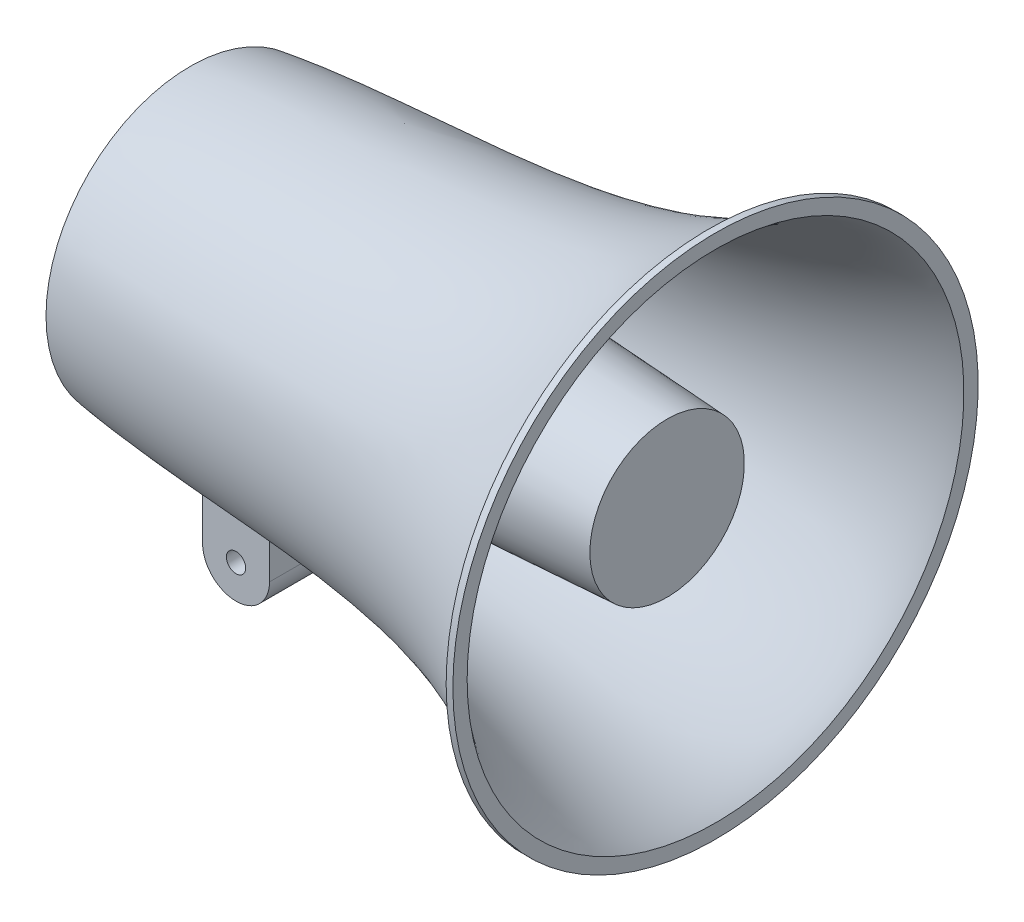
ISO-10303-21;
HEADER;
FILE_DESCRIPTION(('STEP AP214'),'2;1');
FILE_NAME('part.step','',(''),(''),'','','');
FILE_SCHEMA(('AUTOMOTIVE_DESIGN { 1 0 10303 214 1 1 1 1 }'));
ENDSEC;
DATA;
#1=APPLICATION_CONTEXT('core data for automotive mechanical design processes');
#2=APPLICATION_PROTOCOL_DEFINITION('international standard','automotive_design',2000,#1);
#3=PRODUCT_CONTEXT('',#1,'mechanical');
#4=PRODUCT('Part','Part','',(#3));
#5=PRODUCT_RELATED_PRODUCT_CATEGORY('part','',(#4));
#6=PRODUCT_DEFINITION_FORMATION('','',#4);
#7=PRODUCT_DEFINITION_CONTEXT('part definition',#1,'design');
#8=PRODUCT_DEFINITION('design','',#6,#7);
#9=PRODUCT_DEFINITION_SHAPE('','',#8);
#10=(LENGTH_UNIT() NAMED_UNIT(*) SI_UNIT(.MILLI.,.METRE.));
#11=(NAMED_UNIT(*) PLANE_ANGLE_UNIT() SI_UNIT($,.RADIAN.));
#12=(NAMED_UNIT(*) SI_UNIT($,.STERADIAN.) SOLID_ANGLE_UNIT());
#13=UNCERTAINTY_MEASURE_WITH_UNIT(LENGTH_MEASURE(1.E-05),#10,'distance_accuracy_value','');
#14=(GEOMETRIC_REPRESENTATION_CONTEXT(3) GLOBAL_UNCERTAINTY_ASSIGNED_CONTEXT((#13)) GLOBAL_UNIT_ASSIGNED_CONTEXT((#10,
#11,#12)) REPRESENTATION_CONTEXT('',''));
#15=CARTESIAN_POINT('',(0.,0.,0.));
#16=DIRECTION('',(0.,0.,1.));
#17=DIRECTION('',(1.,0.,0.));
#18=AXIS2_PLACEMENT_3D('',#15,#16,#17);
#19=CARTESIAN_POINT('',(127.882024274006,61.8874618757175,0.));
#20=CARTESIAN_POINT('',(90.8044132288741,35.8427549110067,0.));
#21=CARTESIAN_POINT('',(42.3015007337847,41.7217586179619,0.));
#22=CARTESIAN_POINT('',(0.,35.56,0.));
#23=B_SPLINE_CURVE_WITH_KNOTS('',3,(#19,#20,#21,#22),.UNSPECIFIED.,.F.,.F.,(4,4),(0.,1.),.UNSPECIFIED.);
#24=CARTESIAN_POINT('',(0.,0.,0.));
#25=DIRECTION('',(-1.,0.,0.));
#26=AXIS1_PLACEMENT('',#24,#25);
#27=SURFACE_OF_REVOLUTION('',#23,#26);
#28=CARTESIAN_POINT('',(127.882024274006,0.,0.));
#29=DIRECTION('',(-1.,0.,0.));
#30=DIRECTION('',(0.,0.,1.));
#31=AXIS2_PLACEMENT_3D('',#28,#29,#30);
#32=CIRCLE('',#31,61.8874618757175);
#33=CARTESIAN_POINT('',(127.882024274006,0.,61.8874618757175));
#34=VERTEX_POINT('',#33);
#35=EDGE_CURVE('E94',#34,#34,#32,.T.);
#36=ORIENTED_EDGE('',*,*,#35,.T.);
#37=EDGE_LOOP('',(#36));
#38=FACE_BOUND('',#37,.T.);
#39=CARTESIAN_POINT('',(0.,0.,0.));
#40=DIRECTION('',(-1.,0.,0.));
#41=DIRECTION('',(0.,0.,1.));
#42=AXIS2_PLACEMENT_3D('',#39,#40,#41);
#43=CIRCLE('',#42,35.56);
#44=CARTESIAN_POINT('',(0.,0.,35.56));
#45=VERTEX_POINT('',#44);
#46=EDGE_CURVE('E90',#45,#45,#43,.T.);
#47=ORIENTED_EDGE('',*,*,#46,.F.);
#48=EDGE_LOOP('',(#47));
#49=FACE_BOUND('',#48,.T.);
#50=CARTESIAN_POINT('',(27.178,0.,0.));
#51=DIRECTION('',(-1.,0.,0.));
#52=DIRECTION('',(0.,0.,1.));
#53=AXIS2_PLACEMENT_3D('',#50,#51,#52);
#54=CIRCLE('',#53,38.2471542027441);
#55=CARTESIAN_POINT('',(27.178,-37.4804002727891,-7.62));
#56=VERTEX_POINT('',#55);
#57=CARTESIAN_POINT('',(27.178,-37.4804002727891,7.62));
#58=VERTEX_POINT('',#57);
#59=EDGE_CURVE('E11',#56,#58,#54,.T.);
#60=ORIENTED_EDGE('',*,*,#59,.F.);
#61=CARTESIAN_POINT('',(10.668,-36.0763472887783,-7.62));
#62=CARTESIAN_POINT('',(11.3546755637936,-36.1488445242103,-7.62));
#63=CARTESIAN_POINT('',(12.0415882481351,-36.2190699128754,-7.62));
#64=CARTESIAN_POINT('',(13.4157766772698,-36.355371462205,-7.62));
#65=CARTESIAN_POINT('',(14.1030523930679,-36.4214479149092,-7.62));
#66=CARTESIAN_POINT('',(15.4779277412028,-36.5498538504772,-7.62));
#67=CARTESIAN_POINT('',(16.1655273609823,-36.612183468202,-7.62));
#68=CARTESIAN_POINT('',(17.5410143941941,-36.7334869230939,-7.62));
#69=CARTESIAN_POINT('',(18.2289018043845,-36.7924607970877,-7.62));
#70=CARTESIAN_POINT('',(19.6049120074151,-36.9074351380669,-7.62));
#71=CARTESIAN_POINT('',(20.293034795792,-36.9634356585934,-7.62));
#72=CARTESIAN_POINT('',(21.6695037798695,-37.072841532166,-7.62));
#73=CARTESIAN_POINT('',(22.3578499807939,-37.1262468193515,-7.62));
#74=CARTESIAN_POINT('',(23.7347374571186,-37.2308327076714,-7.62));
#75=CARTESIAN_POINT('',(24.4232787390018,-37.2820132231885,-7.62));
#76=CARTESIAN_POINT('',(25.8005293884462,-37.3825127833583,-7.62));
#77=CARTESIAN_POINT('',(26.489238762319,-37.4318317416216,-7.62));
#78=CARTESIAN_POINT('',(27.178,-37.4804002727891,-7.61999999999999));
#79=B_SPLINE_CURVE_WITH_KNOTS('',3,(#61,#62,#63,#64,#65,#66,#67,#68,#69,#70,#71,#72,#73,#74,#75,
#76,#77,#78),.UNSPECIFIED.,.F.,.F.,(4,2,2,2,2,2,2,2,4),(0.,2.07146822178206,4.14279047110517,
6.21403812202543,8.28526303827297,10.3564506453109,12.4276907865564,14.49901056632,
16.5704263521352),.UNSPECIFIED.);
#80=CARTESIAN_POINT('',(10.668,-36.0763472887783,-7.62));
#81=VERTEX_POINT('',#80);
#82=EDGE_CURVE('E144',#81,#56,#79,.T.);
#83=ORIENTED_EDGE('',*,*,#82,.F.);
#84=CARTESIAN_POINT('',(10.668,0.,0.));
#85=DIRECTION('',(-1.,0.,0.));
#86=DIRECTION('',(0.,0.,1.));
#87=AXIS2_PLACEMENT_3D('',#84,#85,#86);
#88=CIRCLE('',#87,36.8723098503544);
#89=CARTESIAN_POINT('',(10.668,-36.0763472887783,7.62));
#90=VERTEX_POINT('',#89);
#91=EDGE_CURVE('E191',#90,#81,#88,.F.);
#92=ORIENTED_EDGE('',*,*,#91,.F.);
#93=CARTESIAN_POINT('',(10.668,-36.0763472887783,7.62));
#94=CARTESIAN_POINT('',(11.3546755637936,-36.1488445242103,7.62));
#95=CARTESIAN_POINT('',(12.0415882481351,-36.2190699128754,7.62));
#96=CARTESIAN_POINT('',(13.4157766772698,-36.355371462205,7.62));
#97=CARTESIAN_POINT('',(14.1030523930679,-36.4214479149092,7.62));
#98=CARTESIAN_POINT('',(15.4779277412028,-36.5498538504772,7.62));
#99=CARTESIAN_POINT('',(16.1655273609823,-36.612183468202,7.62));
#100=CARTESIAN_POINT('',(17.5410143941941,-36.7334869230939,7.62));
#101=CARTESIAN_POINT('',(18.2289018043845,-36.7924607970877,7.62));
#102=CARTESIAN_POINT('',(19.6049120074151,-36.9074351380669,7.62));
#103=CARTESIAN_POINT('',(20.293034795792,-36.9634356585934,7.62));
#104=CARTESIAN_POINT('',(21.6695037798695,-37.072841532166,7.62));
#105=CARTESIAN_POINT('',(22.3578499807939,-37.1262468193515,7.62));
#106=CARTESIAN_POINT('',(23.7347374571186,-37.2308327076714,7.62));
#107=CARTESIAN_POINT('',(24.4232787390018,-37.2820132231885,7.62));
#108=CARTESIAN_POINT('',(25.8005293884462,-37.3825127833583,7.62));
#109=CARTESIAN_POINT('',(26.489238762319,-37.4318317416216,7.62));
#110=CARTESIAN_POINT('',(27.178,-37.4804002727891,7.62));
#111=B_SPLINE_CURVE_WITH_KNOTS('',3,(#93,#94,#95,#96,#97,#98,#99,#100,#101,#102,#103,#104,#105,
#106,#107,#108,#109,#110),.UNSPECIFIED.,.F.,.F.,(4,2,2,2,2,2,2,2,4),(0.,2.07146822178206,
4.14279047110517,6.21403812202543,8.28526303827297,10.3564506453109,12.4276907865564,
14.49901056632,16.5704263521352),.UNSPECIFIED.);
#112=EDGE_CURVE('E40',#90,#58,#111,.T.);
#113=ORIENTED_EDGE('',*,*,#112,.T.);
#114=EDGE_LOOP('',(#60,#83,#92,#113));
#115=FACE_BOUND('',#114,.T.);
#116=ADVANCED_FACE('F32',(#38,#49,#115),#27,.T.);
#117=CARTESIAN_POINT('',(117.602,19.05,0.));
#118=DIRECTION('',(-1.,0.,0.));
#119=DIRECTION('',(0.,0.,1.));
#120=AXIS2_PLACEMENT_3D('',#117,#118,#119);
#121=PLANE('',#120);
#122=CARTESIAN_POINT('',(117.602,0.,0.));
#123=DIRECTION('',(-1.,0.,0.));
#124=DIRECTION('',(0.,0.,1.));
#125=AXIS2_PLACEMENT_3D('',#122,#123,#124);
#126=CIRCLE('',#125,19.05);
#127=CARTESIAN_POINT('',(117.602,0.,19.05));
#128=VERTEX_POINT('',#127);
#129=EDGE_CURVE('E193',#128,#128,#126,.T.);
#130=ORIENTED_EDGE('',*,*,#129,.F.);
#131=EDGE_LOOP('',(#130));
#132=FACE_BOUND('',#131,.T.);
#133=ADVANCED_FACE('F34',(#132),#121,.F.);
#134=CARTESIAN_POINT('',(117.602,0.,0.));
#135=DIRECTION('',(-1.,0.,0.));
#136=DIRECTION('',(0.,0.,1.));
#137=AXIS2_PLACEMENT_3D('',#134,#135,#136);
#138=CONICAL_SURFACE('',#137,19.05,0.0564445228975095);
#139=CARTESIAN_POINT('',(48.26,0.,0.));
#140=DIRECTION('',(-1.,0.,0.));
#141=DIRECTION('',(0.,0.,1.));
#142=AXIS2_PLACEMENT_3D('',#139,#140,#141);
#143=CIRCLE('',#142,22.968138032738);
#144=CARTESIAN_POINT('',(48.26,0.,22.968138032738));
#145=VERTEX_POINT('',#144);
#146=EDGE_CURVE('E195',#145,#145,#143,.T.);
#147=ORIENTED_EDGE('',*,*,#146,.F.);
#148=EDGE_LOOP('',(#147));
#149=FACE_BOUND('',#148,.T.);
#150=ORIENTED_EDGE('',*,*,#129,.T.);
#151=EDGE_LOOP('',(#150));
#152=FACE_BOUND('',#151,.T.);
#153=ADVANCED_FACE('F119',(#149,#152),#138,.T.);
#154=CARTESIAN_POINT('',(48.26,38.6704164179285,0.));
#155=DIRECTION('',(-1.,0.,0.));
#156=DIRECTION('',(0.,0.,1.));
#157=AXIS2_PLACEMENT_3D('',#154,#155,#156);
#158=PLANE('',#157);
#159=CARTESIAN_POINT('',(48.26,0.,0.));
#160=DIRECTION('',(-1.,0.,0.));
#161=DIRECTION('',(0.,0.,1.));
#162=AXIS2_PLACEMENT_3D('',#159,#160,#161);
#163=CIRCLE('',#162,38.6704164179285);
#164=CARTESIAN_POINT('',(48.26,0.,38.6704164179285));
#165=VERTEX_POINT('',#164);
#166=EDGE_CURVE('E200',#165,#165,#163,.T.);
#167=ORIENTED_EDGE('',*,*,#166,.F.);
#168=EDGE_LOOP('',(#167));
#169=FACE_BOUND('',#168,.T.);
#170=ORIENTED_EDGE('',*,*,#146,.T.);
#171=EDGE_LOOP('',(#170));
#172=FACE_BOUND('',#171,.T.);
#173=ADVANCED_FACE('F115',(#169,#172),#158,.F.);
#174=CARTESIAN_POINT('',(48.26,38.6704164179285,0.));
#175=CARTESIAN_POINT('',(60.5791680522577,39.2621312735668,0.));
#176=CARTESIAN_POINT('',(92.7596563229144,42.3505388280006,0.));
#177=CARTESIAN_POINT('',(122.108766376293,55.0340535043362,0.));
#178=CARTESIAN_POINT('',(129.54,61.2519918368869,0.));
#179=B_SPLINE_CURVE_WITH_KNOTS('',3,(#174,#175,#176,#177,#178),.UNSPECIFIED.,.F.,.F.,(4,1,4),
(0.,0.316214134256956,0.787254411821224),.UNSPECIFIED.);
#180=CARTESIAN_POINT('',(0.,0.,0.));
#181=DIRECTION('',(-1.,0.,0.));
#182=AXIS1_PLACEMENT('',#180,#181);
#183=SURFACE_OF_REVOLUTION('',#179,#182);
#184=CARTESIAN_POINT('',(129.54,0.,0.));
#185=DIRECTION('',(-1.,0.,0.));
#186=DIRECTION('',(0.,0.,1.));
#187=AXIS2_PLACEMENT_3D('',#184,#185,#186);
#188=CIRCLE('',#187,61.2519918368869);
#189=CARTESIAN_POINT('',(129.54,0.,61.2519918368869));
#190=VERTEX_POINT('',#189);
#191=EDGE_CURVE('E203',#190,#190,#188,.T.);
#192=ORIENTED_EDGE('',*,*,#191,.F.);
#193=EDGE_LOOP('',(#192));
#194=FACE_BOUND('',#193,.T.);
#195=ORIENTED_EDGE('',*,*,#166,.T.);
#196=EDGE_LOOP('',(#195));
#197=FACE_BOUND('',#196,.T.);
#198=ADVANCED_FACE('F110',(#194,#197),#183,.T.);
#199=CARTESIAN_POINT('',(129.54,64.77,0.));
#200=DIRECTION('',(-1.,0.,0.));
#201=DIRECTION('',(0.,0.,1.));
#202=AXIS2_PLACEMENT_3D('',#199,#200,#201);
#203=PLANE('',#202);
#204=CARTESIAN_POINT('',(129.54,0.,0.));
#205=DIRECTION('',(-1.,0.,0.));
#206=DIRECTION('',(0.,0.,1.));
#207=AXIS2_PLACEMENT_3D('',#204,#205,#206);
#208=CIRCLE('',#207,64.77);
#209=CARTESIAN_POINT('',(129.54,0.,64.77));
#210=VERTEX_POINT('',#209);
#211=EDGE_CURVE('E206',#210,#210,#208,.T.);
#212=ORIENTED_EDGE('',*,*,#211,.F.);
#213=EDGE_LOOP('',(#212));
#214=FACE_BOUND('',#213,.T.);
#215=ORIENTED_EDGE('',*,*,#191,.T.);
#216=EDGE_LOOP('',(#215));
#217=FACE_BOUND('',#216,.T.);
#218=ADVANCED_FACE('F114',(#214,#217),#203,.F.);
#219=CARTESIAN_POINT('',(0.,0.,0.));
#220=DIRECTION('',(-1.,0.,0.));
#221=DIRECTION('',(0.,0.,1.));
#222=AXIS2_PLACEMENT_3D('',#219,#220,#221);
#223=CYLINDRICAL_SURFACE('',#222,64.77);
#224=CARTESIAN_POINT('',(127.882024274006,0.,0.));
#225=DIRECTION('',(-1.,0.,0.));
#226=DIRECTION('',(0.,0.,1.));
#227=AXIS2_PLACEMENT_3D('',#224,#225,#226);
#228=CIRCLE('',#227,64.77);
#229=CARTESIAN_POINT('',(127.882024274006,0.,64.77));
#230=VERTEX_POINT('',#229);
#231=EDGE_CURVE('E209',#230,#230,#228,.T.);
#232=ORIENTED_EDGE('',*,*,#231,.F.);
#233=EDGE_LOOP('',(#232));
#234=FACE_BOUND('',#233,.T.);
#235=ORIENTED_EDGE('',*,*,#211,.T.);
#236=EDGE_LOOP('',(#235));
#237=FACE_BOUND('',#236,.T.);
#238=ADVANCED_FACE('F216',(#234,#237),#223,.T.);
#239=CARTESIAN_POINT('',(127.882024274006,61.8874618757175,0.));
#240=DIRECTION('',(1.,0.,0.));
#241=DIRECTION('',(0.,0.,-1.));
#242=AXIS2_PLACEMENT_3D('',#239,#240,#241);
#243=PLANE('',#242);
#244=ORIENTED_EDGE('',*,*,#35,.F.);
#245=EDGE_LOOP('',(#244));
#246=FACE_BOUND('',#245,.T.);
#247=ORIENTED_EDGE('',*,*,#231,.T.);
#248=EDGE_LOOP('',(#247));
#249=FACE_BOUND('',#248,.T.);
#250=ADVANCED_FACE('F141',(#246,#249),#243,.F.);
#251=CARTESIAN_POINT('',(0.,0.,0.));
#252=DIRECTION('',(1.,0.,0.));
#253=DIRECTION('',(0.,0.,-1.));
#254=AXIS2_PLACEMENT_3D('',#251,#252,#253);
#255=PLANE('',#254);
#256=ORIENTED_EDGE('',*,*,#46,.T.);
#257=EDGE_LOOP('',(#256));
#258=FACE_BOUND('',#257,.T.);
#259=ADVANCED_FACE('F139',(#258),#255,.F.);
#260=CARTESIAN_POINT('',(18.923,-57.15,7.62));
#261=DIRECTION('',(0.,0.,1.));
#262=DIRECTION('',(1.,0.,0.));
#263=AXIS2_PLACEMENT_3D('',#260,#261,#262);
#264=PLANE('',#263);
#265=CARTESIAN_POINT('',(18.923,-57.15,7.62));
#266=DIRECTION('',(0.,0.,1.));
#267=DIRECTION('',(1.,0.,0.));
#268=AXIS2_PLACEMENT_3D('',#265,#266,#267);
#269=CIRCLE('',#268,2.37960308561871);
#270=CARTESIAN_POINT('',(16.5433969143813,-57.15,7.62));
#271=VERTEX_POINT('',#270);
#272=EDGE_CURVE('E179',#271,#271,#269,.T.);
#273=ORIENTED_EDGE('',*,*,#272,.F.);
#274=EDGE_LOOP('',(#273));
#275=FACE_BOUND('',#274,.T.);
#276=ORIENTED_EDGE('',*,*,#112,.F.);
#277=DIRECTION('',(0.,-1.,0.));
#278=VECTOR('',#277,1.);
#279=CARTESIAN_POINT('',(10.668,-57.15,7.62));
#280=LINE('',#279,#278);
#281=CARTESIAN_POINT('',(10.668,-57.15,7.62));
#282=VERTEX_POINT('',#281);
#283=EDGE_CURVE('E76',#90,#282,#280,.T.);
#284=ORIENTED_EDGE('',*,*,#283,.T.);
#285=CARTESIAN_POINT('',(18.923,-57.15,7.62));
#286=DIRECTION('',(0.,0.,1.));
#287=DIRECTION('',(1.,0.,0.));
#288=AXIS2_PLACEMENT_3D('',#285,#286,#287);
#289=CIRCLE('',#288,8.25500000000001);
#290=CARTESIAN_POINT('',(27.178,-57.15,7.62));
#291=VERTEX_POINT('',#290);
#292=EDGE_CURVE('E77',#282,#291,#289,.T.);
#293=ORIENTED_EDGE('',*,*,#292,.T.);
#294=DIRECTION('',(0.,1.,0.));
#295=VECTOR('',#294,1.);
#296=CARTESIAN_POINT('',(27.178,0.,7.62));
#297=LINE('',#296,#295);
#298=EDGE_CURVE('E68',#291,#58,#297,.T.);
#299=ORIENTED_EDGE('',*,*,#298,.T.);
#300=EDGE_LOOP('',(#276,#284,#293,#299));
#301=FACE_BOUND('',#300,.T.);
#302=ADVANCED_FACE('F80',(#275,#301),#264,.T.);
#303=CARTESIAN_POINT('',(18.923,-57.15,-7.62));
#304=DIRECTION('',(0.,0.,1.));
#305=DIRECTION('',(1.,0.,0.));
#306=AXIS2_PLACEMENT_3D('',#303,#304,#305);
#307=PLANE('',#306);
#308=CARTESIAN_POINT('',(18.923,-57.15,-7.62));
#309=DIRECTION('',(0.,0.,1.));
#310=DIRECTION('',(1.,0.,0.));
#311=AXIS2_PLACEMENT_3D('',#308,#309,#310);
#312=CIRCLE('',#311,2.37960308561871);
#313=CARTESIAN_POINT('',(16.5433969143813,-57.15,-7.62));
#314=VERTEX_POINT('',#313);
#315=EDGE_CURVE('E182',#314,#314,#312,.T.);
#316=ORIENTED_EDGE('',*,*,#315,.T.);
#317=EDGE_LOOP('',(#316));
#318=FACE_BOUND('',#317,.T.);
#319=DIRECTION('',(0.,-1.,0.));
#320=VECTOR('',#319,1.);
#321=CARTESIAN_POINT('',(10.668,-57.15,-7.62));
#322=LINE('',#321,#320);
#323=CARTESIAN_POINT('',(10.668,-57.15,-7.62));
#324=VERTEX_POINT('',#323);
#325=EDGE_CURVE('E85',#81,#324,#322,.T.);
#326=ORIENTED_EDGE('',*,*,#325,.F.);
#327=ORIENTED_EDGE('',*,*,#82,.T.);
#328=DIRECTION('',(0.,1.,0.));
#329=VECTOR('',#328,1.);
#330=CARTESIAN_POINT('',(27.178,0.,-7.62));
#331=LINE('',#330,#329);
#332=CARTESIAN_POINT('',(27.178,-57.15,-7.62));
#333=VERTEX_POINT('',#332);
#334=EDGE_CURVE('E188',#333,#56,#331,.T.);
#335=ORIENTED_EDGE('',*,*,#334,.F.);
#336=CARTESIAN_POINT('',(18.923,-57.15,-7.62));
#337=DIRECTION('',(0.,0.,1.));
#338=DIRECTION('',(1.,0.,0.));
#339=AXIS2_PLACEMENT_3D('',#336,#337,#338);
#340=CIRCLE('',#339,8.25500000000001);
#341=EDGE_CURVE('E89',#324,#333,#340,.T.);
#342=ORIENTED_EDGE('',*,*,#341,.F.);
#343=EDGE_LOOP('',(#326,#327,#335,#342));
#344=FACE_BOUND('',#343,.T.);
#345=ADVANCED_FACE('F157',(#318,#344),#307,.F.);
#346=CARTESIAN_POINT('',(27.178,0.,7.62));
#347=DIRECTION('',(-1.,0.,0.));
#348=DIRECTION('',(0.,-1.,0.));
#349=AXIS2_PLACEMENT_3D('',#346,#347,#348);
#350=PLANE('',#349);
#351=ORIENTED_EDGE('',*,*,#334,.T.);
#352=ORIENTED_EDGE('',*,*,#59,.T.);
#353=ORIENTED_EDGE('',*,*,#298,.F.);
#354=DIRECTION('',(0.,0.,-1.));
#355=VECTOR('',#354,1.);
#356=CARTESIAN_POINT('',(27.178,-57.15,7.62));
#357=LINE('',#356,#355);
#358=EDGE_CURVE('E73',#291,#333,#357,.T.);
#359=ORIENTED_EDGE('',*,*,#358,.T.);
#360=EDGE_LOOP('',(#351,#352,#353,#359));
#361=FACE_BOUND('',#360,.T.);
#362=ADVANCED_FACE('F71',(#361),#350,.F.);
#363=CARTESIAN_POINT('',(10.668,-57.15,7.62));
#364=DIRECTION('',(1.,0.,0.));
#365=DIRECTION('',(0.,1.,0.));
#366=AXIS2_PLACEMENT_3D('',#363,#364,#365);
#367=PLANE('',#366);
#368=ORIENTED_EDGE('',*,*,#283,.F.);
#369=ORIENTED_EDGE('',*,*,#91,.T.);
#370=ORIENTED_EDGE('',*,*,#325,.T.);
#371=DIRECTION('',(0.,0.,-1.));
#372=VECTOR('',#371,1.);
#373=CARTESIAN_POINT('',(10.668,-57.15,7.62));
#374=LINE('',#373,#372);
#375=EDGE_CURVE('E91',#282,#324,#374,.T.);
#376=ORIENTED_EDGE('',*,*,#375,.F.);
#377=EDGE_LOOP('',(#368,#369,#370,#376));
#378=FACE_BOUND('',#377,.T.);
#379=ADVANCED_FACE('F164',(#378),#367,.F.);
#380=CARTESIAN_POINT('',(18.923,-57.15,7.62));
#381=DIRECTION('',(0.,0.,-1.));
#382=DIRECTION('',(-1.,0.,0.));
#383=AXIS2_PLACEMENT_3D('',#380,#381,#382);
#384=CYLINDRICAL_SURFACE('',#383,8.25500000000001);
#385=ORIENTED_EDGE('',*,*,#341,.T.);
#386=ORIENTED_EDGE('',*,*,#358,.F.);
#387=ORIENTED_EDGE('',*,*,#292,.F.);
#388=ORIENTED_EDGE('',*,*,#375,.T.);
#389=EDGE_LOOP('',(#385,#386,#387,#388));
#390=FACE_BOUND('',#389,.T.);
#391=ADVANCED_FACE('F87',(#390),#384,.T.);
#392=CARTESIAN_POINT('',(18.923,-57.15,7.62));
#393=DIRECTION('',(0.,0.,-1.));
#394=DIRECTION('',(-1.,0.,0.));
#395=AXIS2_PLACEMENT_3D('',#392,#393,#394);
#396=CYLINDRICAL_SURFACE('',#395,2.37960308561871);
#397=CARTESIAN_POINT('',(16.5433969143813,-57.15,7.62));
#398=CARTESIAN_POINT('',(16.5433969143813,-57.15,7.46125));
#399=CARTESIAN_POINT('',(16.5433969143813,-57.15,7.3025));
#400=CARTESIAN_POINT('',(16.5433969143813,-57.15,6.985));
#401=CARTESIAN_POINT('',(16.5433969143813,-57.15,6.82625));
#402=CARTESIAN_POINT('',(16.5433969143813,-57.15,6.50875));
#403=CARTESIAN_POINT('',(16.5433969143813,-57.15,6.35));
#404=CARTESIAN_POINT('',(16.5433969143813,-57.15,6.0325));
#405=CARTESIAN_POINT('',(16.5433969143813,-57.15,5.87375));
#406=CARTESIAN_POINT('',(16.5433969143813,-57.15,5.55625));
#407=CARTESIAN_POINT('',(16.5433969143813,-57.15,5.3975));
#408=CARTESIAN_POINT('',(16.5433969143813,-57.15,5.08));
#409=CARTESIAN_POINT('',(16.5433969143813,-57.15,4.92125));
#410=CARTESIAN_POINT('',(16.5433969143813,-57.15,4.60375));
#411=CARTESIAN_POINT('',(16.5433969143813,-57.15,4.445));
#412=CARTESIAN_POINT('',(16.5433969143813,-57.15,4.1275));
#413=CARTESIAN_POINT('',(16.5433969143813,-57.15,3.96875));
#414=CARTESIAN_POINT('',(16.5433969143813,-57.15,3.65125));
#415=CARTESIAN_POINT('',(16.5433969143813,-57.15,3.4925));
#416=CARTESIAN_POINT('',(16.5433969143813,-57.15,3.175));
#417=CARTESIAN_POINT('',(16.5433969143813,-57.15,3.01625));
#418=CARTESIAN_POINT('',(16.5433969143813,-57.15,2.69875));
#419=CARTESIAN_POINT('',(16.5433969143813,-57.15,2.54));
#420=CARTESIAN_POINT('',(16.5433969143813,-57.15,2.2225));
#421=CARTESIAN_POINT('',(16.5433969143813,-57.15,2.06375));
#422=CARTESIAN_POINT('',(16.5433969143813,-57.15,1.74625));
#423=CARTESIAN_POINT('',(16.5433969143813,-57.15,1.5875));
#424=CARTESIAN_POINT('',(16.5433969143813,-57.15,1.27));
#425=CARTESIAN_POINT('',(16.5433969143813,-57.15,1.11125));
#426=CARTESIAN_POINT('',(16.5433969143813,-57.15,0.79375));
#427=CARTESIAN_POINT('',(16.5433969143813,-57.15,0.635));
#428=CARTESIAN_POINT('',(16.5433969143813,-57.15,0.3175));
#429=CARTESIAN_POINT('',(16.5433969143813,-57.15,0.15875));
#430=CARTESIAN_POINT('',(16.5433969143813,-57.15,-0.158749999999999));
#431=CARTESIAN_POINT('',(16.5433969143813,-57.15,-0.317499999999999));
#432=CARTESIAN_POINT('',(16.5433969143813,-57.15,-0.634999999999999));
#433=CARTESIAN_POINT('',(16.5433969143813,-57.15,-0.793749999999999));
#434=CARTESIAN_POINT('',(16.5433969143813,-57.15,-1.11125));
#435=CARTESIAN_POINT('',(16.5433969143813,-57.15,-1.27));
#436=CARTESIAN_POINT('',(16.5433969143813,-57.15,-1.5875));
#437=CARTESIAN_POINT('',(16.5433969143813,-57.15,-1.74625));
#438=CARTESIAN_POINT('',(16.5433969143813,-57.15,-2.06375));
#439=CARTESIAN_POINT('',(16.5433969143813,-57.15,-2.2225));
#440=CARTESIAN_POINT('',(16.5433969143813,-57.15,-2.54));
#441=CARTESIAN_POINT('',(16.5433969143813,-57.15,-2.69875));
#442=CARTESIAN_POINT('',(16.5433969143813,-57.15,-3.01625));
#443=CARTESIAN_POINT('',(16.5433969143813,-57.15,-3.175));
#444=CARTESIAN_POINT('',(16.5433969143813,-57.15,-3.4925));
#445=CARTESIAN_POINT('',(16.5433969143813,-57.15,-3.65125));
#446=CARTESIAN_POINT('',(16.5433969143813,-57.15,-3.96875));
#447=CARTESIAN_POINT('',(16.5433969143813,-57.15,-4.1275));
#448=CARTESIAN_POINT('',(16.5433969143813,-57.15,-4.445));
#449=CARTESIAN_POINT('',(16.5433969143813,-57.15,-4.60375));
#450=CARTESIAN_POINT('',(16.5433969143813,-57.15,-4.92125));
#451=CARTESIAN_POINT('',(16.5433969143813,-57.15,-5.08));
#452=CARTESIAN_POINT('',(16.5433969143813,-57.15,-5.3975));
#453=CARTESIAN_POINT('',(16.5433969143813,-57.15,-5.55625));
#454=CARTESIAN_POINT('',(16.5433969143813,-57.15,-5.87375));
#455=CARTESIAN_POINT('',(16.5433969143813,-57.15,-6.0325));
#456=CARTESIAN_POINT('',(16.5433969143813,-57.15,-6.35));
#457=CARTESIAN_POINT('',(16.5433969143813,-57.15,-6.50875));
#458=CARTESIAN_POINT('',(16.5433969143813,-57.15,-6.82625));
#459=CARTESIAN_POINT('',(16.5433969143813,-57.15,-6.985));
#460=CARTESIAN_POINT('',(16.5433969143813,-57.15,-7.3025));
#461=CARTESIAN_POINT('',(16.5433969143813,-57.15,-7.46125));
#462=CARTESIAN_POINT('',(16.5433969143813,-57.15,-7.62));
#463=B_SPLINE_CURVE_WITH_KNOTS('',3,(#397,#398,#399,#400,#401,#402,#403,#404,#405,#406,#407,
#408,#409,#410,#411,#412,#413,#414,#415,#416,#417,#418,#419,#420,#421,#422,#423,#424,#425,#426,
#427,#428,#429,#430,#431,#432,#433,#434,#435,#436,#437,#438,#439,#440,#441,#442,#443,#444,#445,
#446,#447,#448,#449,#450,#451,#452,#453,#454,#455,#456,#457,#458,#459,#460,#461,#462),
.UNSPECIFIED.,.F.,.F.,(4,2,2,2,2,2,2,2,2,2,2,2,2,2,2,2,2,2,2,2,2,2,2,2,2,2,2,2,2,2,2,2,4),(0.,
0.47625,0.9525,1.42875,1.905,2.38125,2.8575,3.33375,3.81,4.28625,4.7625,5.23875,5.715,6.19125,
6.6675,7.14375,7.62,8.09625,8.5725,9.04875,9.525,10.00125,10.4775,10.95375,11.43,11.90625,
12.3825,12.85875,13.335,13.81125,14.2875,14.76375,15.24),.UNSPECIFIED.);
#464=EDGE_CURVE('BSEAM159',#271,#314,#463,.T.);
#465=ORIENTED_EDGE('',*,*,#272,.T.);
#466=ORIENTED_EDGE('',*,*,#315,.F.);
#467=ORIENTED_EDGE('',*,*,#464,.T.);
#468=ORIENTED_EDGE('',*,*,#464,.F.);
#469=EDGE_LOOP('',(#465,#467,#466,#468));
#470=FACE_BOUND('',#469,.T.);
#471=ADVANCED_FACE('F159',(#470),#396,.F.);
#472=CLOSED_SHELL('',(#116,#133,#153,#173,#198,#218,#238,#250,#259,#302,#345,#362,#379,#391,#471));
#473=MANIFOLD_SOLID_BREP('B2',#472);
#474=ADVANCED_BREP_SHAPE_REPRESENTATION('',(#18,#473),#14);
#475=SHAPE_DEFINITION_REPRESENTATION(#9,#474);
ENDSEC;
END-ISO-10303-21;
